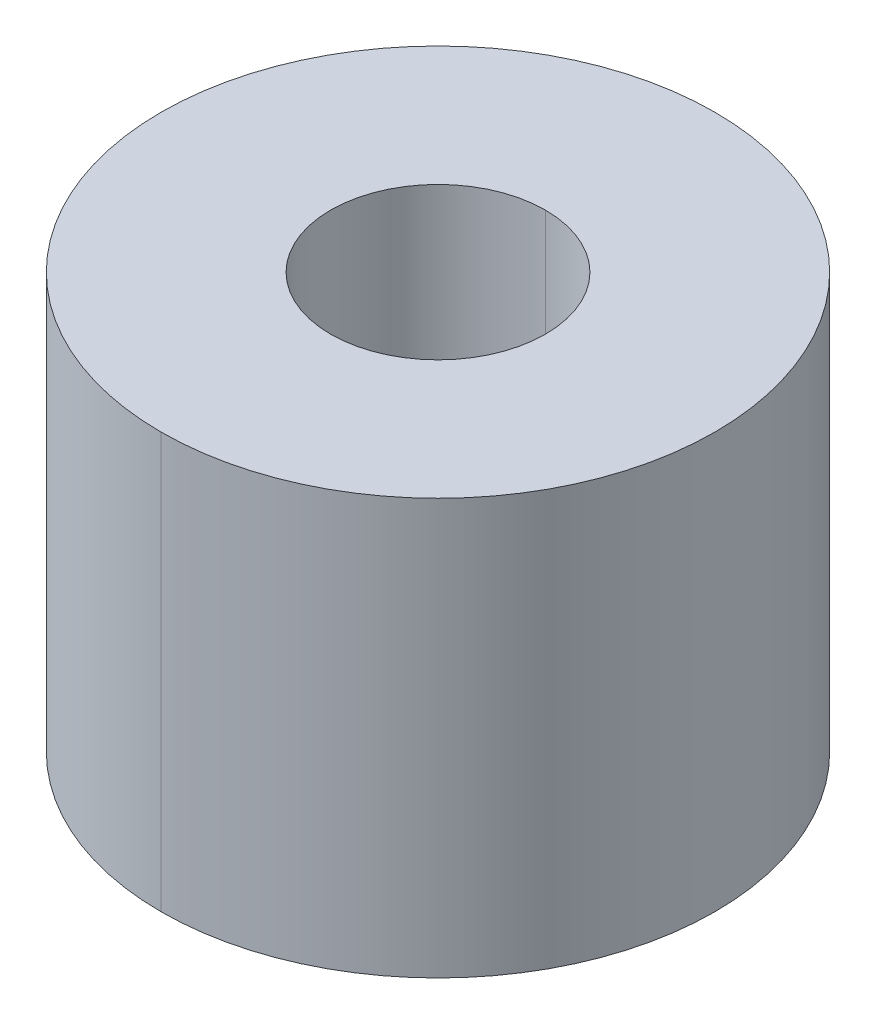
ISO-10303-21;
HEADER;
FILE_DESCRIPTION(('STEP AP214'),'2;1');
FILE_NAME('part.step','',(''),(''),'','','');
FILE_SCHEMA(('AUTOMOTIVE_DESIGN { 1 0 10303 214 1 1 1 1 }'));
ENDSEC;
DATA;
#1=APPLICATION_CONTEXT('core data for automotive mechanical design processes');
#2=APPLICATION_PROTOCOL_DEFINITION('international standard','automotive_design',2000,#1);
#3=PRODUCT_CONTEXT('',#1,'mechanical');
#4=PRODUCT('Part','Part','',(#3));
#5=PRODUCT_RELATED_PRODUCT_CATEGORY('part','',(#4));
#6=PRODUCT_DEFINITION_FORMATION('','',#4);
#7=PRODUCT_DEFINITION_CONTEXT('part definition',#1,'design');
#8=PRODUCT_DEFINITION('design','',#6,#7);
#9=PRODUCT_DEFINITION_SHAPE('','',#8);
#10=(LENGTH_UNIT() NAMED_UNIT(*) SI_UNIT(.MILLI.,.METRE.));
#11=(NAMED_UNIT(*) PLANE_ANGLE_UNIT() SI_UNIT($,.RADIAN.));
#12=(NAMED_UNIT(*) SI_UNIT($,.STERADIAN.) SOLID_ANGLE_UNIT());
#13=UNCERTAINTY_MEASURE_WITH_UNIT(LENGTH_MEASURE(1.E-05),#10,'distance_accuracy_value','');
#14=(GEOMETRIC_REPRESENTATION_CONTEXT(3) GLOBAL_UNCERTAINTY_ASSIGNED_CONTEXT((#13)) GLOBAL_UNIT_ASSIGNED_CONTEXT((#10,
#11,#12)) REPRESENTATION_CONTEXT('',''));
#15=CARTESIAN_POINT('',(0.,0.,0.));
#16=DIRECTION('',(0.,0.,1.));
#17=DIRECTION('',(1.,0.,0.));
#18=AXIS2_PLACEMENT_3D('',#15,#16,#17);
#19=CARTESIAN_POINT('',(0.,-4.7625,0.));
#20=DIRECTION('',(0.,1.,0.));
#21=DIRECTION('',(1.,0.,0.));
#22=AXIS2_PLACEMENT_3D('',#19,#20,#21);
#23=PLANE('',#22);
#24=CARTESIAN_POINT('',(0.,-4.7625,0.));
#25=DIRECTION('',(0.,1.,0.));
#26=DIRECTION('',(0.,0.,1.));
#27=AXIS2_PLACEMENT_3D('',#24,#25,#26);
#28=CIRCLE('',#27,6.35);
#29=CARTESIAN_POINT('',(0.,-4.7625,-6.35));
#30=VERTEX_POINT('',#29);
#31=CARTESIAN_POINT('',(0.,-4.7625,6.35));
#32=VERTEX_POINT('',#31);
#33=EDGE_CURVE('E41',#30,#32,#28,.T.);
#34=ORIENTED_EDGE('',*,*,#33,.F.);
#35=CARTESIAN_POINT('',(0.,-4.7625,0.));
#36=DIRECTION('',(0.,1.,0.));
#37=DIRECTION('',(0.,0.,1.));
#38=AXIS2_PLACEMENT_3D('',#35,#36,#37);
#39=CIRCLE('',#38,6.35);
#40=EDGE_CURVE('E116',#32,#30,#39,.T.);
#41=ORIENTED_EDGE('',*,*,#40,.F.);
#42=EDGE_LOOP('',(#34,#41));
#43=FACE_BOUND('',#42,.T.);
#44=CARTESIAN_POINT('',(0.,-4.7625,0.));
#45=DIRECTION('',(0.,1.,0.));
#46=DIRECTION('',(0.,0.,1.));
#47=AXIS2_PLACEMENT_3D('',#44,#45,#46);
#48=CIRCLE('',#47,2.4638);
#49=CARTESIAN_POINT('',(0.,-4.7625,-2.4638));
#50=VERTEX_POINT('',#49);
#51=CARTESIAN_POINT('',(0.,-4.7625,2.4638));
#52=VERTEX_POINT('',#51);
#53=EDGE_CURVE('E10',#50,#52,#48,.T.);
#54=ORIENTED_EDGE('',*,*,#53,.T.);
#55=CARTESIAN_POINT('',(0.,-4.7625,0.));
#56=DIRECTION('',(0.,1.,0.));
#57=DIRECTION('',(0.,0.,1.));
#58=AXIS2_PLACEMENT_3D('',#55,#56,#57);
#59=CIRCLE('',#58,2.4638);
#60=EDGE_CURVE('E30',#52,#50,#59,.T.);
#61=ORIENTED_EDGE('',*,*,#60,.T.);
#62=EDGE_LOOP('',(#54,#61));
#63=FACE_BOUND('',#62,.T.);
#64=ADVANCED_FACE('F16',(#43,#63),#23,.F.);
#65=CARTESIAN_POINT('',(0.,4.7625,0.));
#66=DIRECTION('',(0.,-1.,0.));
#67=DIRECTION('',(0.,0.,-1.));
#68=AXIS2_PLACEMENT_3D('',#65,#66,#67);
#69=CYLINDRICAL_SURFACE('',#68,6.35);
#70=CARTESIAN_POINT('',(0.,4.7625,0.));
#71=DIRECTION('',(0.,1.,0.));
#72=DIRECTION('',(0.,0.,1.));
#73=AXIS2_PLACEMENT_3D('',#70,#71,#72);
#74=CIRCLE('',#73,6.35);
#75=CARTESIAN_POINT('',(0.,4.7625,6.35));
#76=VERTEX_POINT('',#75);
#77=CARTESIAN_POINT('',(0.,4.7625,-6.35));
#78=VERTEX_POINT('',#77);
#79=EDGE_CURVE('E20',#76,#78,#74,.T.);
#80=ORIENTED_EDGE('',*,*,#79,.F.);
#81=DIRECTION('',(0.,-1.,0.));
#82=VECTOR('',#81,1.);
#83=CARTESIAN_POINT('',(0.,4.7625,6.35));
#84=LINE('',#83,#82);
#85=EDGE_CURVE('E86',#76,#32,#84,.T.);
#86=ORIENTED_EDGE('',*,*,#85,.T.);
#87=ORIENTED_EDGE('',*,*,#40,.T.);
#88=DIRECTION('',(0.,-1.,0.));
#89=VECTOR('',#88,1.);
#90=CARTESIAN_POINT('',(0.,4.7625,-6.35));
#91=LINE('',#90,#89);
#92=EDGE_CURVE('E110',#78,#30,#91,.T.);
#93=ORIENTED_EDGE('',*,*,#92,.F.);
#94=EDGE_LOOP('',(#80,#86,#87,#93));
#95=FACE_BOUND('',#94,.T.);
#96=ADVANCED_FACE('F135',(#95),#69,.T.);
#97=CARTESIAN_POINT('',(0.,4.7625,0.));
#98=DIRECTION('',(0.,-1.,0.));
#99=DIRECTION('',(0.,0.,-1.));
#100=AXIS2_PLACEMENT_3D('',#97,#98,#99);
#101=CYLINDRICAL_SURFACE('',#100,6.35);
#102=ORIENTED_EDGE('',*,*,#85,.F.);
#103=CARTESIAN_POINT('',(0.,4.7625,0.));
#104=DIRECTION('',(0.,1.,0.));
#105=DIRECTION('',(0.,0.,1.));
#106=AXIS2_PLACEMENT_3D('',#103,#104,#105);
#107=CIRCLE('',#106,6.35);
#108=EDGE_CURVE('E96',#78,#76,#107,.T.);
#109=ORIENTED_EDGE('',*,*,#108,.F.);
#110=ORIENTED_EDGE('',*,*,#92,.T.);
#111=ORIENTED_EDGE('',*,*,#33,.T.);
#112=EDGE_LOOP('',(#102,#109,#110,#111));
#113=FACE_BOUND('',#112,.T.);
#114=ADVANCED_FACE('F133',(#113),#101,.T.);
#115=CARTESIAN_POINT('',(0.,4.7625,0.));
#116=DIRECTION('',(0.,-1.,0.));
#117=DIRECTION('',(0.,0.,-1.));
#118=AXIS2_PLACEMENT_3D('',#115,#116,#117);
#119=CYLINDRICAL_SURFACE('',#118,2.4638);
#120=DIRECTION('',(0.,-1.,0.));
#121=VECTOR('',#120,1.);
#122=CARTESIAN_POINT('',(0.,4.7625,2.4638));
#123=LINE('',#122,#121);
#124=CARTESIAN_POINT('',(0.,4.7625,2.4638));
#125=VERTEX_POINT('',#124);
#126=EDGE_CURVE('E72',#125,#52,#123,.T.);
#127=ORIENTED_EDGE('',*,*,#126,.F.);
#128=CARTESIAN_POINT('',(0.,4.7625,0.));
#129=DIRECTION('',(0.,1.,0.));
#130=DIRECTION('',(0.,0.,1.));
#131=AXIS2_PLACEMENT_3D('',#128,#129,#130);
#132=CIRCLE('',#131,2.4638);
#133=CARTESIAN_POINT('',(0.,4.7625,-2.4638));
#134=VERTEX_POINT('',#133);
#135=EDGE_CURVE('E108',#125,#134,#132,.T.);
#136=ORIENTED_EDGE('',*,*,#135,.T.);
#137=DIRECTION('',(0.,-1.,0.));
#138=VECTOR('',#137,1.);
#139=CARTESIAN_POINT('',(0.,4.7625,-2.4638));
#140=LINE('',#139,#138);
#141=EDGE_CURVE('E88',#134,#50,#140,.T.);
#142=ORIENTED_EDGE('',*,*,#141,.T.);
#143=ORIENTED_EDGE('',*,*,#60,.F.);
#144=EDGE_LOOP('',(#127,#136,#142,#143));
#145=FACE_BOUND('',#144,.T.);
#146=ADVANCED_FACE('F83',(#145),#119,.F.);
#147=CARTESIAN_POINT('',(0.,4.7625,0.));
#148=DIRECTION('',(0.,-1.,0.));
#149=DIRECTION('',(0.,0.,-1.));
#150=AXIS2_PLACEMENT_3D('',#147,#148,#149);
#151=CYLINDRICAL_SURFACE('',#150,2.4638);
#152=CARTESIAN_POINT('',(0.,4.7625,0.));
#153=DIRECTION('',(0.,1.,0.));
#154=DIRECTION('',(0.,0.,1.));
#155=AXIS2_PLACEMENT_3D('',#152,#153,#154);
#156=CIRCLE('',#155,2.4638);
#157=EDGE_CURVE('E94',#134,#125,#156,.T.);
#158=ORIENTED_EDGE('',*,*,#157,.T.);
#159=ORIENTED_EDGE('',*,*,#126,.T.);
#160=ORIENTED_EDGE('',*,*,#53,.F.);
#161=ORIENTED_EDGE('',*,*,#141,.F.);
#162=EDGE_LOOP('',(#158,#159,#160,#161));
#163=FACE_BOUND('',#162,.T.);
#164=ADVANCED_FACE('F95',(#163),#151,.F.);
#165=CARTESIAN_POINT('',(0.,4.7625,0.));
#166=DIRECTION('',(0.,1.,0.));
#167=DIRECTION('',(1.,0.,0.));
#168=AXIS2_PLACEMENT_3D('',#165,#166,#167);
#169=PLANE('',#168);
#170=ORIENTED_EDGE('',*,*,#108,.T.);
#171=ORIENTED_EDGE('',*,*,#79,.T.);
#172=EDGE_LOOP('',(#170,#171));
#173=FACE_BOUND('',#172,.T.);
#174=ORIENTED_EDGE('',*,*,#157,.F.);
#175=ORIENTED_EDGE('',*,*,#135,.F.);
#176=EDGE_LOOP('',(#174,#175));
#177=FACE_BOUND('',#176,.T.);
#178=ADVANCED_FACE('F18',(#173,#177),#169,.T.);
#179=CLOSED_SHELL('',(#64,#96,#114,#146,#164,#178));
#180=MANIFOLD_SOLID_BREP('B1',#179);
#181=ADVANCED_BREP_SHAPE_REPRESENTATION('',(#18,#180),#14);
#182=SHAPE_DEFINITION_REPRESENTATION(#9,#181);
ENDSEC;
END-ISO-10303-21;
